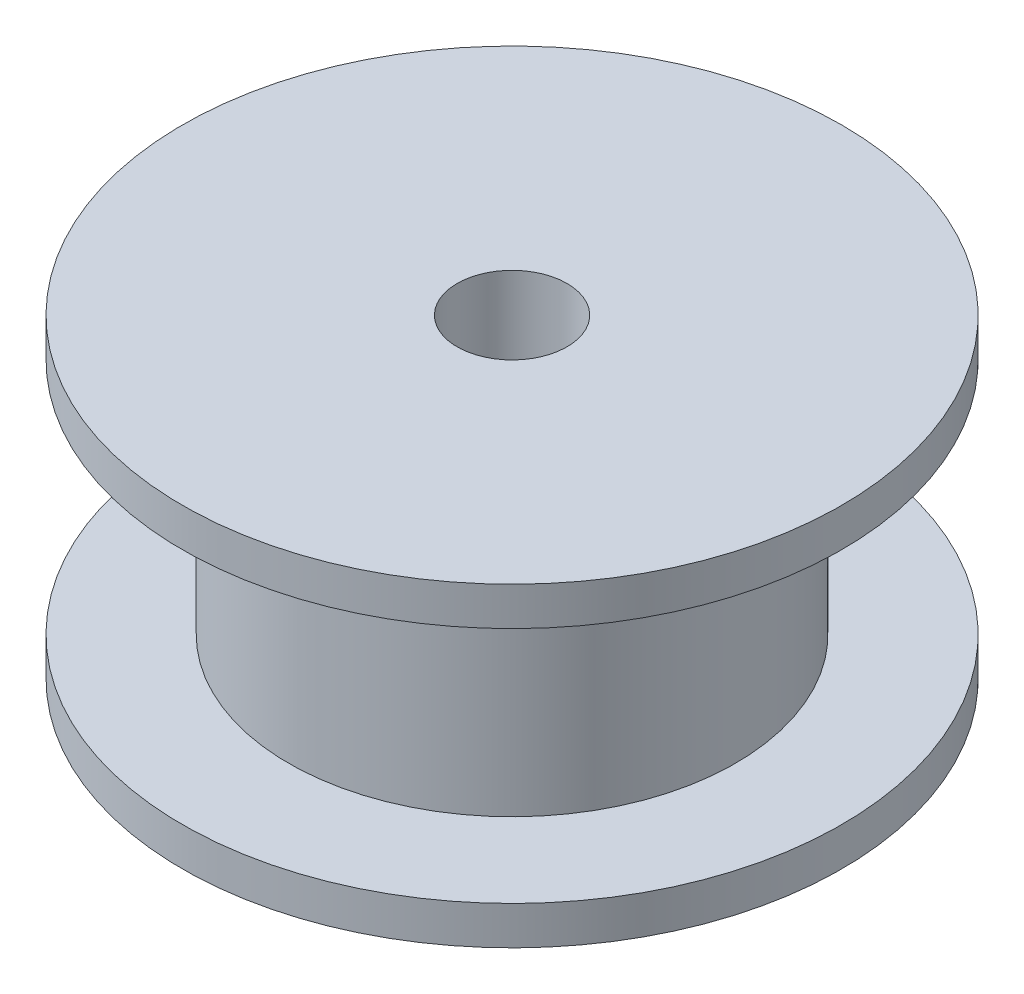
ISO-10303-21;
HEADER;
FILE_DESCRIPTION(('STEP AP214'),'2;1');
FILE_NAME('part.step','',(''),(''),'','','');
FILE_SCHEMA(('AUTOMOTIVE_DESIGN { 1 0 10303 214 1 1 1 1 }'));
ENDSEC;
DATA;
#1=APPLICATION_CONTEXT('core data for automotive mechanical design processes');
#2=APPLICATION_PROTOCOL_DEFINITION('international standard','automotive_design',2000,#1);
#3=PRODUCT_CONTEXT('',#1,'mechanical');
#4=PRODUCT('Part','Part','',(#3));
#5=PRODUCT_RELATED_PRODUCT_CATEGORY('part','',(#4));
#6=PRODUCT_DEFINITION_FORMATION('','',#4);
#7=PRODUCT_DEFINITION_CONTEXT('part definition',#1,'design');
#8=PRODUCT_DEFINITION('design','',#6,#7);
#9=PRODUCT_DEFINITION_SHAPE('','',#8);
#10=(LENGTH_UNIT() NAMED_UNIT(*) SI_UNIT(.MILLI.,.METRE.));
#11=(NAMED_UNIT(*) PLANE_ANGLE_UNIT() SI_UNIT($,.RADIAN.));
#12=(NAMED_UNIT(*) SI_UNIT($,.STERADIAN.) SOLID_ANGLE_UNIT());
#13=UNCERTAINTY_MEASURE_WITH_UNIT(LENGTH_MEASURE(1.E-05),#10,'distance_accuracy_value','');
#14=(GEOMETRIC_REPRESENTATION_CONTEXT(3) GLOBAL_UNCERTAINTY_ASSIGNED_CONTEXT((#13)) GLOBAL_UNIT_ASSIGNED_CONTEXT((#10,
#11,#12)) REPRESENTATION_CONTEXT('',''));
#15=CARTESIAN_POINT('',(0.,0.,0.));
#16=DIRECTION('',(0.,0.,1.));
#17=DIRECTION('',(1.,0.,0.));
#18=AXIS2_PLACEMENT_3D('',#15,#16,#17);
#19=CARTESIAN_POINT('',(0.,0.,0.));
#20=DIRECTION('',(0.,-1.,0.));
#21=DIRECTION('',(0.,0.,-1.));
#22=AXIS2_PLACEMENT_3D('',#19,#20,#21);
#23=CYLINDRICAL_SURFACE('',#22,9.);
#24=CARTESIAN_POINT('',(0.,8.6,0.));
#25=DIRECTION('',(0.,-1.,0.));
#26=DIRECTION('',(0.,0.,-1.));
#27=AXIS2_PLACEMENT_3D('',#24,#25,#26);
#28=CIRCLE('',#27,9.);
#29=CARTESIAN_POINT('',(0.,8.6,-9.));
#30=VERTEX_POINT('',#29);
#31=EDGE_CURVE('E59',#30,#30,#28,.T.);
#32=ORIENTED_EDGE('',*,*,#31,.T.);
#33=EDGE_LOOP('',(#32));
#34=FACE_BOUND('',#33,.T.);
#35=CARTESIAN_POINT('',(0.,7.55,0.));
#36=DIRECTION('',(0.,-1.,0.));
#37=DIRECTION('',(0.,0.,-1.));
#38=AXIS2_PLACEMENT_3D('',#35,#36,#37);
#39=CIRCLE('',#38,9.);
#40=CARTESIAN_POINT('',(0.,7.55,-9.));
#41=VERTEX_POINT('',#40);
#42=EDGE_CURVE('E10',#41,#41,#39,.T.);
#43=ORIENTED_EDGE('',*,*,#42,.F.);
#44=EDGE_LOOP('',(#43));
#45=FACE_BOUND('',#44,.T.);
#46=ADVANCED_FACE('F31',(#34,#45),#23,.T.);
#47=CARTESIAN_POINT('',(9.,7.55,0.));
#48=DIRECTION('',(0.,-1.,0.));
#49=DIRECTION('',(0.,0.,-1.));
#50=AXIS2_PLACEMENT_3D('',#47,#48,#49);
#51=PLANE('',#50);
#52=ORIENTED_EDGE('',*,*,#42,.T.);
#53=EDGE_LOOP('',(#52));
#54=FACE_BOUND('',#53,.T.);
#55=CARTESIAN_POINT('',(0.,7.55,0.));
#56=DIRECTION('',(0.,-1.,0.));
#57=DIRECTION('',(0.,0.,-1.));
#58=AXIS2_PLACEMENT_3D('',#55,#56,#57);
#59=CIRCLE('',#58,6.1);
#60=CARTESIAN_POINT('',(0.,7.55,-6.1));
#61=VERTEX_POINT('',#60);
#62=EDGE_CURVE('E37',#61,#61,#59,.T.);
#63=ORIENTED_EDGE('',*,*,#62,.F.);
#64=EDGE_LOOP('',(#63));
#65=FACE_BOUND('',#64,.T.);
#66=ADVANCED_FACE('F77',(#54,#65),#51,.T.);
#67=CARTESIAN_POINT('',(0.,0.,0.));
#68=DIRECTION('',(0.,-1.,0.));
#69=DIRECTION('',(0.,0.,-1.));
#70=AXIS2_PLACEMENT_3D('',#67,#68,#69);
#71=CYLINDRICAL_SURFACE('',#70,6.1);
#72=ORIENTED_EDGE('',*,*,#62,.T.);
#73=EDGE_LOOP('',(#72));
#74=FACE_BOUND('',#73,.T.);
#75=CARTESIAN_POINT('',(0.,1.05,0.));
#76=DIRECTION('',(0.,-1.,0.));
#77=DIRECTION('',(0.,0.,-1.));
#78=AXIS2_PLACEMENT_3D('',#75,#76,#77);
#79=CIRCLE('',#78,6.1);
#80=CARTESIAN_POINT('',(0.,1.05,-6.1));
#81=VERTEX_POINT('',#80);
#82=EDGE_CURVE('E41',#81,#81,#79,.T.);
#83=ORIENTED_EDGE('',*,*,#82,.F.);
#84=EDGE_LOOP('',(#83));
#85=FACE_BOUND('',#84,.T.);
#86=ADVANCED_FACE('F81',(#74,#85),#71,.T.);
#87=CARTESIAN_POINT('',(6.1,1.05,0.));
#88=DIRECTION('',(0.,1.,0.));
#89=DIRECTION('',(0.,0.,1.));
#90=AXIS2_PLACEMENT_3D('',#87,#88,#89);
#91=PLANE('',#90);
#92=ORIENTED_EDGE('',*,*,#82,.T.);
#93=EDGE_LOOP('',(#92));
#94=FACE_BOUND('',#93,.T.);
#95=CARTESIAN_POINT('',(0.,1.05,0.));
#96=DIRECTION('',(0.,-1.,0.));
#97=DIRECTION('',(0.,0.,-1.));
#98=AXIS2_PLACEMENT_3D('',#95,#96,#97);
#99=CIRCLE('',#98,9.);
#100=CARTESIAN_POINT('',(0.,1.05,-9.));
#101=VERTEX_POINT('',#100);
#102=EDGE_CURVE('E45',#101,#101,#99,.T.);
#103=ORIENTED_EDGE('',*,*,#102,.F.);
#104=EDGE_LOOP('',(#103));
#105=FACE_BOUND('',#104,.T.);
#106=ADVANCED_FACE('F85',(#94,#105),#91,.T.);
#107=CARTESIAN_POINT('',(0.,0.,0.));
#108=DIRECTION('',(0.,-1.,0.));
#109=DIRECTION('',(0.,0.,-1.));
#110=AXIS2_PLACEMENT_3D('',#107,#108,#109);
#111=CYLINDRICAL_SURFACE('',#110,9.);
#112=ORIENTED_EDGE('',*,*,#102,.T.);
#113=EDGE_LOOP('',(#112));
#114=FACE_BOUND('',#113,.T.);
#115=CARTESIAN_POINT('',(0.,0.,0.));
#116=DIRECTION('',(0.,-1.,0.));
#117=DIRECTION('',(0.,0.,-1.));
#118=AXIS2_PLACEMENT_3D('',#115,#116,#117);
#119=CIRCLE('',#118,9.);
#120=CARTESIAN_POINT('',(0.,0.,-9.));
#121=VERTEX_POINT('',#120);
#122=EDGE_CURVE('E50',#121,#121,#119,.T.);
#123=ORIENTED_EDGE('',*,*,#122,.F.);
#124=EDGE_LOOP('',(#123));
#125=FACE_BOUND('',#124,.T.);
#126=ADVANCED_FACE('F91',(#114,#125),#111,.T.);
#127=CARTESIAN_POINT('',(9.,0.,0.));
#128=DIRECTION('',(0.,-1.,0.));
#129=DIRECTION('',(0.,0.,-1.));
#130=AXIS2_PLACEMENT_3D('',#127,#128,#129);
#131=PLANE('',#130);
#132=ORIENTED_EDGE('',*,*,#122,.T.);
#133=EDGE_LOOP('',(#132));
#134=FACE_BOUND('',#133,.T.);
#135=CARTESIAN_POINT('',(0.,0.,0.));
#136=DIRECTION('',(0.,-1.,0.));
#137=DIRECTION('',(0.,0.,-1.));
#138=AXIS2_PLACEMENT_3D('',#135,#136,#137);
#139=CIRCLE('',#138,1.5);
#140=CARTESIAN_POINT('',(0.,0.,-1.5));
#141=VERTEX_POINT('',#140);
#142=EDGE_CURVE('E53',#141,#141,#139,.T.);
#143=ORIENTED_EDGE('',*,*,#142,.F.);
#144=EDGE_LOOP('',(#143));
#145=FACE_BOUND('',#144,.T.);
#146=ADVANCED_FACE('F73',(#134,#145),#131,.T.);
#147=CARTESIAN_POINT('',(0.,0.,0.));
#148=DIRECTION('',(0.,-1.,0.));
#149=DIRECTION('',(0.,0.,-1.));
#150=AXIS2_PLACEMENT_3D('',#147,#148,#149);
#151=CYLINDRICAL_SURFACE('',#150,1.5);
#152=ORIENTED_EDGE('',*,*,#142,.T.);
#153=EDGE_LOOP('',(#152));
#154=FACE_BOUND('',#153,.T.);
#155=CARTESIAN_POINT('',(0.,8.6,0.));
#156=DIRECTION('',(0.,-1.,0.));
#157=DIRECTION('',(0.,0.,-1.));
#158=AXIS2_PLACEMENT_3D('',#155,#156,#157);
#159=CIRCLE('',#158,1.5);
#160=CARTESIAN_POINT('',(0.,8.6,-1.5));
#161=VERTEX_POINT('',#160);
#162=EDGE_CURVE('E56',#161,#161,#159,.T.);
#163=ORIENTED_EDGE('',*,*,#162,.F.);
#164=EDGE_LOOP('',(#163));
#165=FACE_BOUND('',#164,.T.);
#166=ADVANCED_FACE('F67',(#154,#165),#151,.F.);
#167=CARTESIAN_POINT('',(1.5,8.6,0.));
#168=DIRECTION('',(0.,1.,0.));
#169=DIRECTION('',(0.,0.,1.));
#170=AXIS2_PLACEMENT_3D('',#167,#168,#169);
#171=PLANE('',#170);
#172=ORIENTED_EDGE('',*,*,#162,.T.);
#173=EDGE_LOOP('',(#172));
#174=FACE_BOUND('',#173,.T.);
#175=ORIENTED_EDGE('',*,*,#31,.F.);
#176=EDGE_LOOP('',(#175));
#177=FACE_BOUND('',#176,.T.);
#178=ADVANCED_FACE('F65',(#174,#177),#171,.T.);
#179=CLOSED_SHELL('',(#46,#66,#86,#106,#126,#146,#166,#178));
#180=MANIFOLD_SOLID_BREP('B2',#179);
#181=ADVANCED_BREP_SHAPE_REPRESENTATION('',(#18,#180),#14);
#182=SHAPE_DEFINITION_REPRESENTATION(#9,#181);
ENDSEC;
END-ISO-10303-21;
